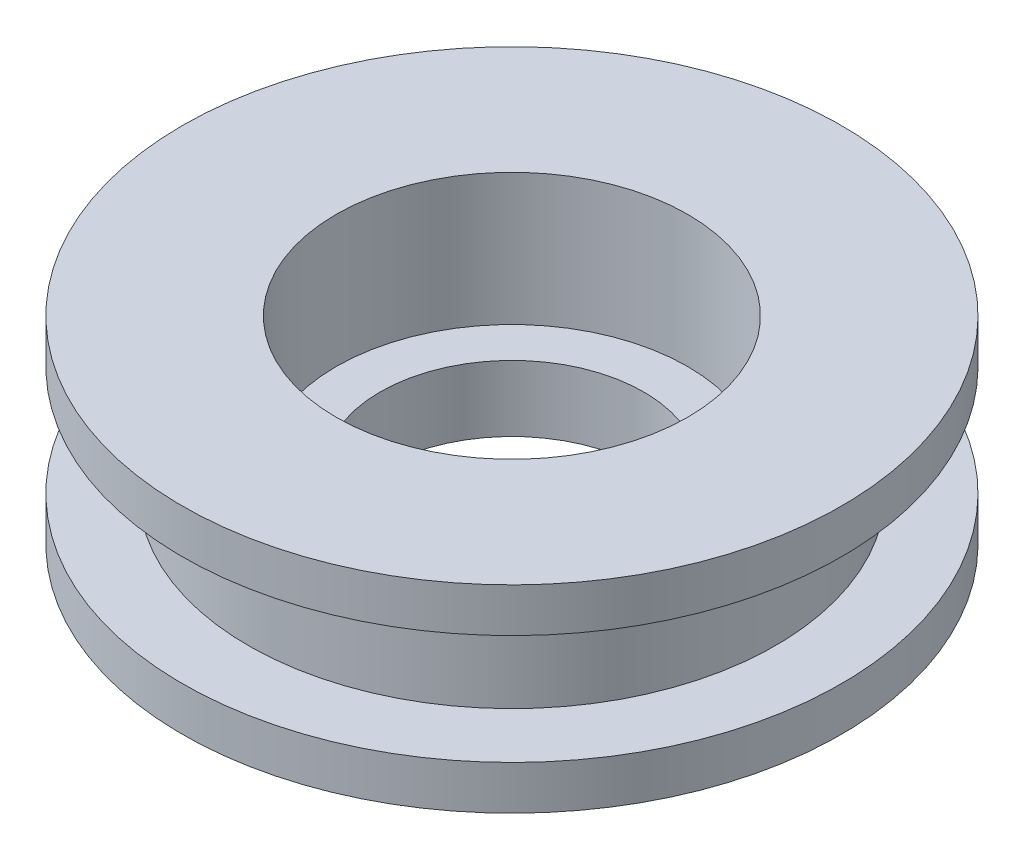
ISO-10303-21;
HEADER;
FILE_DESCRIPTION(('STEP AP214'),'2;1');
FILE_NAME('part.step','',(''),(''),'','','');
FILE_SCHEMA(('AUTOMOTIVE_DESIGN { 1 0 10303 214 1 1 1 1 }'));
ENDSEC;
DATA;
#1=APPLICATION_CONTEXT('core data for automotive mechanical design processes');
#2=APPLICATION_PROTOCOL_DEFINITION('international standard','automotive_design',2000,#1);
#3=PRODUCT_CONTEXT('',#1,'mechanical');
#4=PRODUCT('Part','Part','',(#3));
#5=PRODUCT_RELATED_PRODUCT_CATEGORY('part','',(#4));
#6=PRODUCT_DEFINITION_FORMATION('','',#4);
#7=PRODUCT_DEFINITION_CONTEXT('part definition',#1,'design');
#8=PRODUCT_DEFINITION('design','',#6,#7);
#9=PRODUCT_DEFINITION_SHAPE('','',#8);
#10=(LENGTH_UNIT() NAMED_UNIT(*) SI_UNIT(.MILLI.,.METRE.));
#11=(NAMED_UNIT(*) PLANE_ANGLE_UNIT() SI_UNIT($,.RADIAN.));
#12=(NAMED_UNIT(*) SI_UNIT($,.STERADIAN.) SOLID_ANGLE_UNIT());
#13=UNCERTAINTY_MEASURE_WITH_UNIT(LENGTH_MEASURE(1.E-05),#10,'distance_accuracy_value','');
#14=(GEOMETRIC_REPRESENTATION_CONTEXT(3) GLOBAL_UNCERTAINTY_ASSIGNED_CONTEXT((#13)) GLOBAL_UNIT_ASSIGNED_CONTEXT((#10,
#11,#12)) REPRESENTATION_CONTEXT('',''));
#15=CARTESIAN_POINT('',(0.,0.,0.));
#16=DIRECTION('',(0.,0.,1.));
#17=DIRECTION('',(1.,0.,0.));
#18=AXIS2_PLACEMENT_3D('',#15,#16,#17);
#19=CARTESIAN_POINT('',(4.,2.25,0.));
#20=DIRECTION('',(0.,-1.,0.));
#21=DIRECTION('',(1.,0.,0.));
#22=AXIS2_PLACEMENT_3D('',#19,#20,#21);
#23=PLANE('',#22);
#24=CARTESIAN_POINT('',(0.,2.25,0.));
#25=DIRECTION('',(0.,1.,0.));
#26=DIRECTION('',(-1.,0.,0.));
#27=AXIS2_PLACEMENT_3D('',#24,#25,#26);
#28=CIRCLE('',#27,4.);
#29=CARTESIAN_POINT('',(-4.,2.25,0.));
#30=VERTEX_POINT('',#29);
#31=EDGE_CURVE('E73',#30,#30,#28,.T.);
#32=ORIENTED_EDGE('',*,*,#31,.F.);
#33=EDGE_LOOP('',(#32));
#34=FACE_BOUND('',#33,.T.);
#35=CARTESIAN_POINT('',(0.,2.25,0.));
#36=DIRECTION('',(0.,1.,0.));
#37=DIRECTION('',(-1.,0.,0.));
#38=AXIS2_PLACEMENT_3D('',#35,#36,#37);
#39=CIRCLE('',#38,7.5);
#40=CARTESIAN_POINT('',(-7.5,2.25,0.));
#41=VERTEX_POINT('',#40);
#42=EDGE_CURVE('E10',#41,#41,#39,.T.);
#43=ORIENTED_EDGE('',*,*,#42,.T.);
#44=EDGE_LOOP('',(#43));
#45=FACE_BOUND('',#44,.T.);
#46=ADVANCED_FACE('F39',(#34,#45),#23,.F.);
#47=CARTESIAN_POINT('',(0.,6.62055879509431,0.));
#48=DIRECTION('',(0.,1.,0.));
#49=DIRECTION('',(-1.,0.,0.));
#50=AXIS2_PLACEMENT_3D('',#47,#48,#49);
#51=CYLINDRICAL_SURFACE('',#50,7.5);
#52=ORIENTED_EDGE('',*,*,#42,.F.);
#53=EDGE_LOOP('',(#52));
#54=FACE_BOUND('',#53,.T.);
#55=CARTESIAN_POINT('',(0.,1.25,0.));
#56=DIRECTION('',(0.,1.,0.));
#57=DIRECTION('',(-1.,0.,0.));
#58=AXIS2_PLACEMENT_3D('',#55,#56,#57);
#59=CIRCLE('',#58,7.5);
#60=CARTESIAN_POINT('',(-7.5,1.25,0.));
#61=VERTEX_POINT('',#60);
#62=EDGE_CURVE('E45',#61,#61,#59,.T.);
#63=ORIENTED_EDGE('',*,*,#62,.T.);
#64=EDGE_LOOP('',(#63));
#65=FACE_BOUND('',#64,.T.);
#66=ADVANCED_FACE('F80',(#54,#65),#51,.T.);
#67=CARTESIAN_POINT('',(7.5,1.25,0.));
#68=DIRECTION('',(0.,1.,0.));
#69=DIRECTION('',(-1.,0.,0.));
#70=AXIS2_PLACEMENT_3D('',#67,#68,#69);
#71=PLANE('',#70);
#72=ORIENTED_EDGE('',*,*,#62,.F.);
#73=EDGE_LOOP('',(#72));
#74=FACE_BOUND('',#73,.T.);
#75=CARTESIAN_POINT('',(0.,1.25,0.));
#76=DIRECTION('',(0.,1.,0.));
#77=DIRECTION('',(-1.,0.,0.));
#78=AXIS2_PLACEMENT_3D('',#75,#76,#77);
#79=CIRCLE('',#78,6.);
#80=CARTESIAN_POINT('',(-6.,1.25,0.));
#81=VERTEX_POINT('',#80);
#82=EDGE_CURVE('E49',#81,#81,#79,.T.);
#83=ORIENTED_EDGE('',*,*,#82,.T.);
#84=EDGE_LOOP('',(#83));
#85=FACE_BOUND('',#84,.T.);
#86=ADVANCED_FACE('F84',(#74,#85),#71,.F.);
#87=CARTESIAN_POINT('',(0.,6.62055879509431,0.));
#88=DIRECTION('',(0.,1.,0.));
#89=DIRECTION('',(-1.,0.,0.));
#90=AXIS2_PLACEMENT_3D('',#87,#88,#89);
#91=CYLINDRICAL_SURFACE('',#90,6.);
#92=ORIENTED_EDGE('',*,*,#82,.F.);
#93=EDGE_LOOP('',(#92));
#94=FACE_BOUND('',#93,.T.);
#95=CARTESIAN_POINT('',(0.,-1.25,0.));
#96=DIRECTION('',(0.,1.,0.));
#97=DIRECTION('',(-1.,0.,0.));
#98=AXIS2_PLACEMENT_3D('',#95,#96,#97);
#99=CIRCLE('',#98,6.);
#100=CARTESIAN_POINT('',(-6.,-1.25,0.));
#101=VERTEX_POINT('',#100);
#102=EDGE_CURVE('E53',#101,#101,#99,.T.);
#103=ORIENTED_EDGE('',*,*,#102,.T.);
#104=EDGE_LOOP('',(#103));
#105=FACE_BOUND('',#104,.T.);
#106=ADVANCED_FACE('F89',(#94,#105),#91,.T.);
#107=CARTESIAN_POINT('',(6.,-1.25,0.));
#108=DIRECTION('',(0.,-1.,0.));
#109=DIRECTION('',(1.,0.,0.));
#110=AXIS2_PLACEMENT_3D('',#107,#108,#109);
#111=PLANE('',#110);
#112=ORIENTED_EDGE('',*,*,#102,.F.);
#113=EDGE_LOOP('',(#112));
#114=FACE_BOUND('',#113,.T.);
#115=CARTESIAN_POINT('',(0.,-1.25,0.));
#116=DIRECTION('',(0.,1.,0.));
#117=DIRECTION('',(-1.,0.,0.));
#118=AXIS2_PLACEMENT_3D('',#115,#116,#117);
#119=CIRCLE('',#118,7.5);
#120=CARTESIAN_POINT('',(-7.5,-1.25,0.));
#121=VERTEX_POINT('',#120);
#122=EDGE_CURVE('E58',#121,#121,#119,.T.);
#123=ORIENTED_EDGE('',*,*,#122,.T.);
#124=EDGE_LOOP('',(#123));
#125=FACE_BOUND('',#124,.T.);
#126=ADVANCED_FACE('F95',(#114,#125),#111,.F.);
#127=CARTESIAN_POINT('',(0.,6.62055879509431,0.));
#128=DIRECTION('',(0.,1.,0.));
#129=DIRECTION('',(-1.,0.,0.));
#130=AXIS2_PLACEMENT_3D('',#127,#128,#129);
#131=CYLINDRICAL_SURFACE('',#130,7.5);
#132=ORIENTED_EDGE('',*,*,#122,.F.);
#133=EDGE_LOOP('',(#132));
#134=FACE_BOUND('',#133,.T.);
#135=CARTESIAN_POINT('',(0.,-2.25,0.));
#136=DIRECTION('',(0.,1.,0.));
#137=DIRECTION('',(-1.,0.,0.));
#138=AXIS2_PLACEMENT_3D('',#135,#136,#137);
#139=CIRCLE('',#138,7.5);
#140=CARTESIAN_POINT('',(-7.5,-2.25,0.));
#141=VERTEX_POINT('',#140);
#142=EDGE_CURVE('E61',#141,#141,#139,.T.);
#143=ORIENTED_EDGE('',*,*,#142,.T.);
#144=EDGE_LOOP('',(#143));
#145=FACE_BOUND('',#144,.T.);
#146=ADVANCED_FACE('F99',(#134,#145),#131,.T.);
#147=CARTESIAN_POINT('',(7.5,-2.25,0.));
#148=DIRECTION('',(0.,1.,0.));
#149=DIRECTION('',(-1.,0.,0.));
#150=AXIS2_PLACEMENT_3D('',#147,#148,#149);
#151=PLANE('',#150);
#152=ORIENTED_EDGE('',*,*,#142,.F.);
#153=EDGE_LOOP('',(#152));
#154=FACE_BOUND('',#153,.T.);
#155=CARTESIAN_POINT('',(0.,-2.25,0.));
#156=DIRECTION('',(0.,1.,0.));
#157=DIRECTION('',(-1.,0.,0.));
#158=AXIS2_PLACEMENT_3D('',#155,#156,#157);
#159=CIRCLE('',#158,3.);
#160=CARTESIAN_POINT('',(-3.,-2.25,0.));
#161=VERTEX_POINT('',#160);
#162=EDGE_CURVE('E64',#161,#161,#159,.T.);
#163=ORIENTED_EDGE('',*,*,#162,.T.);
#164=EDGE_LOOP('',(#163));
#165=FACE_BOUND('',#164,.T.);
#166=ADVANCED_FACE('F103',(#154,#165),#151,.F.);
#167=CARTESIAN_POINT('',(0.,6.62055879509431,0.));
#168=DIRECTION('',(0.,1.,0.));
#169=DIRECTION('',(-1.,0.,0.));
#170=AXIS2_PLACEMENT_3D('',#167,#168,#169);
#171=CYLINDRICAL_SURFACE('',#170,3.);
#172=ORIENTED_EDGE('',*,*,#162,.F.);
#173=EDGE_LOOP('',(#172));
#174=FACE_BOUND('',#173,.T.);
#175=CARTESIAN_POINT('',(0.,-0.75,0.));
#176=DIRECTION('',(0.,1.,0.));
#177=DIRECTION('',(-1.,0.,0.));
#178=AXIS2_PLACEMENT_3D('',#175,#176,#177);
#179=CIRCLE('',#178,3.);
#180=CARTESIAN_POINT('',(-3.,-0.75,0.));
#181=VERTEX_POINT('',#180);
#182=EDGE_CURVE('E67',#181,#181,#179,.T.);
#183=ORIENTED_EDGE('',*,*,#182,.T.);
#184=EDGE_LOOP('',(#183));
#185=FACE_BOUND('',#184,.T.);
#186=ADVANCED_FACE('F107',(#174,#185),#171,.F.);
#187=CARTESIAN_POINT('',(3.,-0.75,0.));
#188=DIRECTION('',(0.,-1.,0.));
#189=DIRECTION('',(1.,0.,0.));
#190=AXIS2_PLACEMENT_3D('',#187,#188,#189);
#191=PLANE('',#190);
#192=ORIENTED_EDGE('',*,*,#182,.F.);
#193=EDGE_LOOP('',(#192));
#194=FACE_BOUND('',#193,.T.);
#195=CARTESIAN_POINT('',(0.,-0.750000000000001,0.));
#196=DIRECTION('',(0.,1.,0.));
#197=DIRECTION('',(-1.,0.,0.));
#198=AXIS2_PLACEMENT_3D('',#195,#196,#197);
#199=CIRCLE('',#198,4.);
#200=CARTESIAN_POINT('',(-4.,-0.750000000000001,0.));
#201=VERTEX_POINT('',#200);
#202=EDGE_CURVE('E70',#201,#201,#199,.T.);
#203=ORIENTED_EDGE('',*,*,#202,.T.);
#204=EDGE_LOOP('',(#203));
#205=FACE_BOUND('',#204,.T.);
#206=ADVANCED_FACE('F111',(#194,#205),#191,.F.);
#207=CARTESIAN_POINT('',(0.,6.62055879509431,0.));
#208=DIRECTION('',(0.,1.,0.));
#209=DIRECTION('',(-1.,0.,0.));
#210=AXIS2_PLACEMENT_3D('',#207,#208,#209);
#211=CYLINDRICAL_SURFACE('',#210,4.);
#212=ORIENTED_EDGE('',*,*,#202,.F.);
#213=EDGE_LOOP('',(#212));
#214=FACE_BOUND('',#213,.T.);
#215=ORIENTED_EDGE('',*,*,#31,.T.);
#216=EDGE_LOOP('',(#215));
#217=FACE_BOUND('',#216,.T.);
#218=ADVANCED_FACE('F77',(#214,#217),#211,.F.);
#219=CLOSED_SHELL('',(#46,#66,#86,#106,#126,#146,#166,#186,#206,#218));
#220=MANIFOLD_SOLID_BREP('B2',#219);
#221=ADVANCED_BREP_SHAPE_REPRESENTATION('',(#18,#220),#14);
#222=SHAPE_DEFINITION_REPRESENTATION(#9,#221);
ENDSEC;
END-ISO-10303-21;
